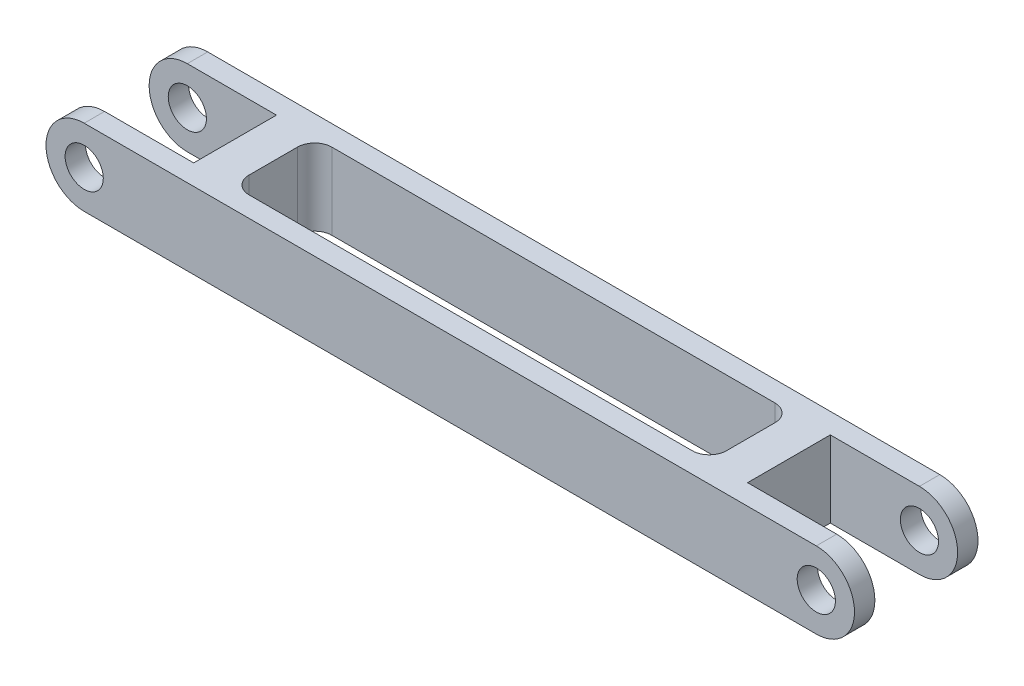
ISO-10303-21;
HEADER;
FILE_DESCRIPTION(('STEP AP214'),'2;1');
FILE_NAME('part.step','',(''),(''),'','','');
FILE_SCHEMA(('AUTOMOTIVE_DESIGN { 1 0 10303 214 1 1 1 1 }'));
ENDSEC;
DATA;
#1=APPLICATION_CONTEXT('core data for automotive mechanical design processes');
#2=APPLICATION_PROTOCOL_DEFINITION('international standard','automotive_design',2000,#1);
#3=PRODUCT_CONTEXT('',#1,'mechanical');
#4=PRODUCT('Part','Part','',(#3));
#5=PRODUCT_RELATED_PRODUCT_CATEGORY('part','',(#4));
#6=PRODUCT_DEFINITION_FORMATION('','',#4);
#7=PRODUCT_DEFINITION_CONTEXT('part definition',#1,'design');
#8=PRODUCT_DEFINITION('design','',#6,#7);
#9=PRODUCT_DEFINITION_SHAPE('','',#8);
#10=(LENGTH_UNIT() NAMED_UNIT(*) SI_UNIT(.MILLI.,.METRE.));
#11=(NAMED_UNIT(*) PLANE_ANGLE_UNIT() SI_UNIT($,.RADIAN.));
#12=(NAMED_UNIT(*) SI_UNIT($,.STERADIAN.) SOLID_ANGLE_UNIT());
#13=UNCERTAINTY_MEASURE_WITH_UNIT(LENGTH_MEASURE(1.E-05),#10,'distance_accuracy_value','');
#14=(GEOMETRIC_REPRESENTATION_CONTEXT(3) GLOBAL_UNCERTAINTY_ASSIGNED_CONTEXT((#13)) GLOBAL_UNIT_ASSIGNED_CONTEXT((#10,
#11,#12)) REPRESENTATION_CONTEXT('',''));
#15=CARTESIAN_POINT('',(0.,0.,0.));
#16=DIRECTION('',(0.,0.,1.));
#17=DIRECTION('',(1.,0.,0.));
#18=AXIS2_PLACEMENT_3D('',#15,#16,#17);
#19=CARTESIAN_POINT('',(-57.5,0.,19.4));
#20=DIRECTION('',(0.,0.,-1.));
#21=DIRECTION('',(-1.,0.,0.));
#22=AXIS2_PLACEMENT_3D('',#19,#20,#21);
#23=CYLINDRICAL_SURFACE('',#22,6.);
#24=CARTESIAN_POINT('',(-57.5,0.,3.2));
#25=DIRECTION('',(0.,0.,-1.));
#26=DIRECTION('',(-1.,0.,0.));
#27=AXIS2_PLACEMENT_3D('',#24,#25,#26);
#28=CIRCLE('',#27,6.);
#29=CARTESIAN_POINT('',(-57.5,-6.00000000000002,3.2));
#30=VERTEX_POINT('',#29);
#31=CARTESIAN_POINT('',(-57.5,6.,3.2));
#32=VERTEX_POINT('',#31);
#33=EDGE_CURVE('E346',#30,#32,#28,.T.);
#34=ORIENTED_EDGE('',*,*,#33,.T.);
#35=DIRECTION('',(0.,0.,-1.));
#36=VECTOR('',#35,1.);
#37=CARTESIAN_POINT('',(-57.5,6.,19.4));
#38=LINE('',#37,#36);
#39=CARTESIAN_POINT('',(-57.5,6.,0.));
#40=VERTEX_POINT('',#39);
#41=EDGE_CURVE('E380',#32,#40,#38,.T.);
#42=ORIENTED_EDGE('',*,*,#41,.T.);
#43=CARTESIAN_POINT('',(-57.5,0.,0.));
#44=DIRECTION('',(0.,0.,1.));
#45=DIRECTION('',(1.,0.,0.));
#46=AXIS2_PLACEMENT_3D('',#43,#44,#45);
#47=CIRCLE('',#46,6.);
#48=CARTESIAN_POINT('',(-57.5,-6.,0.));
#49=VERTEX_POINT('',#48);
#50=EDGE_CURVE('E362',#40,#49,#47,.T.);
#51=ORIENTED_EDGE('',*,*,#50,.T.);
#52=DIRECTION('',(0.,0.,-1.));
#53=VECTOR('',#52,1.);
#54=CARTESIAN_POINT('',(-57.5,-6.,19.4));
#55=LINE('',#54,#53);
#56=EDGE_CURVE('E49',#30,#49,#55,.T.);
#57=ORIENTED_EDGE('',*,*,#56,.F.);
#58=EDGE_LOOP('',(#34,#42,#51,#57));
#59=FACE_BOUND('',#58,.T.);
#60=ADVANCED_FACE('F39',(#59),#23,.T.);
#61=CARTESIAN_POINT('',(57.5,0.,19.4));
#62=DIRECTION('',(0.,0.,-1.));
#63=DIRECTION('',(-1.,0.,0.));
#64=AXIS2_PLACEMENT_3D('',#61,#62,#63);
#65=CYLINDRICAL_SURFACE('',#64,6.);
#66=DIRECTION('',(0.,0.,-1.));
#67=VECTOR('',#66,1.);
#68=CARTESIAN_POINT('',(57.5,6.00000000000002,19.4));
#69=LINE('',#68,#67);
#70=CARTESIAN_POINT('',(57.5,6.00000000000002,3.19999999999999));
#71=VERTEX_POINT('',#70);
#72=CARTESIAN_POINT('',(57.5,6.00000000000002,0.));
#73=VERTEX_POINT('',#72);
#74=EDGE_CURVE('E399',#71,#73,#69,.T.);
#75=ORIENTED_EDGE('',*,*,#74,.F.);
#76=CARTESIAN_POINT('',(57.5,0.,3.19999999999998));
#77=DIRECTION('',(0.,0.,-1.));
#78=DIRECTION('',(-1.,0.,0.));
#79=AXIS2_PLACEMENT_3D('',#76,#77,#78);
#80=CIRCLE('',#79,6.);
#81=CARTESIAN_POINT('',(57.5,-6.,3.19999999999999));
#82=VERTEX_POINT('',#81);
#83=EDGE_CURVE('E339',#71,#82,#80,.T.);
#84=ORIENTED_EDGE('',*,*,#83,.T.);
#85=DIRECTION('',(0.,0.,-1.));
#86=VECTOR('',#85,1.);
#87=CARTESIAN_POINT('',(57.5,-5.99999999999998,19.4));
#88=LINE('',#87,#86);
#89=CARTESIAN_POINT('',(57.5,-5.99999999999998,0.));
#90=VERTEX_POINT('',#89);
#91=EDGE_CURVE('E404',#82,#90,#88,.T.);
#92=ORIENTED_EDGE('',*,*,#91,.T.);
#93=CARTESIAN_POINT('',(57.5,0.,0.));
#94=DIRECTION('',(0.,0.,1.));
#95=DIRECTION('',(1.,0.,0.));
#96=AXIS2_PLACEMENT_3D('',#93,#94,#95);
#97=CIRCLE('',#96,6.);
#98=EDGE_CURVE('E388',#90,#73,#97,.T.);
#99=ORIENTED_EDGE('',*,*,#98,.T.);
#100=EDGE_LOOP('',(#75,#84,#92,#99));
#101=FACE_BOUND('',#100,.T.);
#102=ADVANCED_FACE('F453',(#101),#65,.T.);
#103=CARTESIAN_POINT('',(-57.5,0.,19.4));
#104=DIRECTION('',(0.,0.,-1.));
#105=DIRECTION('',(-1.,0.,0.));
#106=AXIS2_PLACEMENT_3D('',#103,#104,#105);
#107=CYLINDRICAL_SURFACE('',#106,2.99999999999999);
#108=CARTESIAN_POINT('',(-57.5,0.,3.2));
#109=DIRECTION('',(0.,0.,-1.));
#110=DIRECTION('',(-1.,0.,0.));
#111=AXIS2_PLACEMENT_3D('',#108,#109,#110);
#112=CIRCLE('',#111,2.99999999999999);
#113=CARTESIAN_POINT('',(-60.5,0.,3.2));
#114=VERTEX_POINT('',#113);
#115=EDGE_CURVE('E43',#114,#114,#112,.T.);
#116=ORIENTED_EDGE('',*,*,#115,.F.);
#117=EDGE_LOOP('',(#116));
#118=FACE_BOUND('',#117,.T.);
#119=CARTESIAN_POINT('',(-57.5,0.,0.));
#120=DIRECTION('',(0.,0.,1.));
#121=DIRECTION('',(1.,0.,0.));
#122=AXIS2_PLACEMENT_3D('',#119,#120,#121);
#123=CIRCLE('',#122,2.99999999999999);
#124=CARTESIAN_POINT('',(-54.5,0.,0.));
#125=VERTEX_POINT('',#124);
#126=EDGE_CURVE('E354',#125,#125,#123,.T.);
#127=ORIENTED_EDGE('',*,*,#126,.F.);
#128=EDGE_LOOP('',(#127));
#129=FACE_BOUND('',#128,.T.);
#130=ADVANCED_FACE('F425',(#118,#129),#107,.F.);
#131=CARTESIAN_POINT('',(57.5,0.,19.4));
#132=DIRECTION('',(0.,0.,-1.));
#133=DIRECTION('',(-1.,0.,0.));
#134=AXIS2_PLACEMENT_3D('',#131,#132,#133);
#135=CYLINDRICAL_SURFACE('',#134,2.99999999999999);
#136=CARTESIAN_POINT('',(57.5,0.,3.19999999999998));
#137=DIRECTION('',(0.,0.,-1.));
#138=DIRECTION('',(-1.,0.,0.));
#139=AXIS2_PLACEMENT_3D('',#136,#137,#138);
#140=CIRCLE('',#139,2.99999999999999);
#141=CARTESIAN_POINT('',(54.5,0.,3.19999999999999));
#142=VERTEX_POINT('',#141);
#143=EDGE_CURVE('E338',#142,#142,#140,.T.);
#144=ORIENTED_EDGE('',*,*,#143,.F.);
#145=EDGE_LOOP('',(#144));
#146=FACE_BOUND('',#145,.T.);
#147=CARTESIAN_POINT('',(57.5,0.,0.));
#148=DIRECTION('',(0.,0.,1.));
#149=DIRECTION('',(1.,0.,0.));
#150=AXIS2_PLACEMENT_3D('',#147,#148,#149);
#151=CIRCLE('',#150,2.99999999999999);
#152=CARTESIAN_POINT('',(60.5,0.,0.));
#153=VERTEX_POINT('',#152);
#154=EDGE_CURVE('E349',#153,#153,#151,.T.);
#155=ORIENTED_EDGE('',*,*,#154,.F.);
#156=EDGE_LOOP('',(#155));
#157=FACE_BOUND('',#156,.T.);
#158=ADVANCED_FACE('F432',(#146,#157),#135,.F.);
#159=CARTESIAN_POINT('',(-57.5,0.,19.4));
#160=DIRECTION('',(0.,0.,1.));
#161=DIRECTION('',(1.,0.,0.));
#162=AXIS2_PLACEMENT_3D('',#159,#160,#161);
#163=PLANE('',#162);
#164=CARTESIAN_POINT('',(-57.5,0.,19.4));
#165=DIRECTION('',(0.,0.,1.));
#166=DIRECTION('',(1.,0.,0.));
#167=AXIS2_PLACEMENT_3D('',#164,#165,#166);
#168=CIRCLE('',#167,2.99999999999999);
#169=CARTESIAN_POINT('',(-54.5,0.,19.4));
#170=VERTEX_POINT('',#169);
#171=EDGE_CURVE('E358',#170,#170,#168,.T.);
#172=ORIENTED_EDGE('',*,*,#171,.F.);
#173=EDGE_LOOP('',(#172));
#174=FACE_BOUND('',#173,.T.);
#175=CARTESIAN_POINT('',(-57.5,0.,19.4));
#176=DIRECTION('',(0.,0.,1.));
#177=DIRECTION('',(1.,0.,0.));
#178=AXIS2_PLACEMENT_3D('',#175,#176,#177);
#179=CIRCLE('',#178,6.);
#180=CARTESIAN_POINT('',(-57.5,6.,19.4));
#181=VERTEX_POINT('',#180);
#182=CARTESIAN_POINT('',(-57.5,-6.,19.4));
#183=VERTEX_POINT('',#182);
#184=EDGE_CURVE('E366',#181,#183,#179,.T.);
#185=ORIENTED_EDGE('',*,*,#184,.T.);
#186=DIRECTION('',(1.,0.,0.));
#187=VECTOR('',#186,1.);
#188=CARTESIAN_POINT('',(-57.5,-6.,19.4));
#189=LINE('',#188,#187);
#190=CARTESIAN_POINT('',(57.5,-5.99999999999998,19.4));
#191=VERTEX_POINT('',#190);
#192=EDGE_CURVE('E370',#183,#191,#189,.T.);
#193=ORIENTED_EDGE('',*,*,#192,.T.);
#194=CARTESIAN_POINT('',(57.5,0.,19.4));
#195=DIRECTION('',(0.,0.,1.));
#196=DIRECTION('',(1.,0.,0.));
#197=AXIS2_PLACEMENT_3D('',#194,#195,#196);
#198=CIRCLE('',#197,6.);
#199=CARTESIAN_POINT('',(57.5,6.00000000000002,19.4));
#200=VERTEX_POINT('',#199);
#201=EDGE_CURVE('E374',#191,#200,#198,.T.);
#202=ORIENTED_EDGE('',*,*,#201,.T.);
#203=DIRECTION('',(-1.,0.,0.));
#204=VECTOR('',#203,1.);
#205=CARTESIAN_POINT('',(-57.5,6.,19.4));
#206=LINE('',#205,#204);
#207=EDGE_CURVE('E377',#200,#181,#206,.T.);
#208=ORIENTED_EDGE('',*,*,#207,.T.);
#209=EDGE_LOOP('',(#185,#193,#202,#208));
#210=FACE_BOUND('',#209,.T.);
#211=CARTESIAN_POINT('',(57.5,0.,19.4));
#212=DIRECTION('',(0.,0.,1.));
#213=DIRECTION('',(1.,0.,0.));
#214=AXIS2_PLACEMENT_3D('',#211,#212,#213);
#215=CIRCLE('',#214,2.99999999999999);
#216=CARTESIAN_POINT('',(60.5,0.,19.4));
#217=VERTEX_POINT('',#216);
#218=EDGE_CURVE('E350',#217,#217,#215,.T.);
#219=ORIENTED_EDGE('',*,*,#218,.F.);
#220=EDGE_LOOP('',(#219));
#221=FACE_BOUND('',#220,.T.);
#222=ADVANCED_FACE('F428',(#174,#210,#221),#163,.T.);
#223=CARTESIAN_POINT('',(-57.5,0.,0.));
#224=DIRECTION('',(0.,0.,1.));
#225=DIRECTION('',(1.,0.,0.));
#226=AXIS2_PLACEMENT_3D('',#223,#224,#225);
#227=PLANE('',#226);
#228=ORIENTED_EDGE('',*,*,#50,.F.);
#229=DIRECTION('',(-1.,0.,0.));
#230=VECTOR('',#229,1.);
#231=CARTESIAN_POINT('',(-57.5,6.,0.));
#232=LINE('',#231,#230);
#233=EDGE_CURVE('E371',#73,#40,#232,.T.);
#234=ORIENTED_EDGE('',*,*,#233,.F.);
#235=ORIENTED_EDGE('',*,*,#98,.F.);
#236=DIRECTION('',(1.,0.,0.));
#237=VECTOR('',#236,1.);
#238=CARTESIAN_POINT('',(-57.5,-6.,0.));
#239=LINE('',#238,#237);
#240=EDGE_CURVE('E384',#49,#90,#239,.T.);
#241=ORIENTED_EDGE('',*,*,#240,.F.);
#242=EDGE_LOOP('',(#228,#234,#235,#241));
#243=FACE_BOUND('',#242,.T.);
#244=ORIENTED_EDGE('',*,*,#126,.T.);
#245=EDGE_LOOP('',(#244));
#246=FACE_BOUND('',#245,.T.);
#247=ORIENTED_EDGE('',*,*,#154,.T.);
#248=EDGE_LOOP('',(#247));
#249=FACE_BOUND('',#248,.T.);
#250=ADVANCED_FACE('F431',(#243,#246,#249),#227,.F.);
#251=CARTESIAN_POINT('',(-57.5,6.,16.2));
#252=VERTEX_POINT('',#251);
#253=EDGE_CURVE('E395',#181,#252,#38,.T.);
#254=ORIENTED_EDGE('',*,*,#253,.T.);
#255=CARTESIAN_POINT('',(-57.5,0.,16.2));
#256=DIRECTION('',(0.,0.,1.));
#257=DIRECTION('',(1.,0.,0.));
#258=AXIS2_PLACEMENT_3D('',#255,#256,#257);
#259=CIRCLE('',#258,6.);
#260=CARTESIAN_POINT('',(-57.5,-6.00000000000002,16.2));
#261=VERTEX_POINT('',#260);
#262=EDGE_CURVE('E343',#252,#261,#259,.T.);
#263=ORIENTED_EDGE('',*,*,#262,.T.);
#264=EDGE_CURVE('E11',#183,#261,#55,.T.);
#265=ORIENTED_EDGE('',*,*,#264,.F.);
#266=ORIENTED_EDGE('',*,*,#184,.F.);
#267=EDGE_LOOP('',(#254,#263,#265,#266));
#268=FACE_BOUND('',#267,.T.);
#269=ADVANCED_FACE('F41',(#268),#23,.T.);
#270=CARTESIAN_POINT('',(-57.5,-6.,19.4));
#271=DIRECTION('',(0.,1.,0.));
#272=DIRECTION('',(-1.,0.,0.));
#273=AXIS2_PLACEMENT_3D('',#270,#271,#272);
#274=PLANE('',#273);
#275=DIRECTION('',(0.,0.,-1.));
#276=VECTOR('',#275,1.);
#277=CARTESIAN_POINT('',(-43.5,-6.00000000000002,3.2));
#278=LINE('',#277,#276);
#279=CARTESIAN_POINT('',(-43.5,-6.00000000000002,16.2));
#280=VERTEX_POINT('',#279);
#281=CARTESIAN_POINT('',(-43.5,-6.00000000000002,3.2));
#282=VERTEX_POINT('',#281);
#283=EDGE_CURVE('E195',#280,#282,#278,.T.);
#284=ORIENTED_EDGE('',*,*,#283,.T.);
#285=DIRECTION('',(-1.,0.,0.));
#286=VECTOR('',#285,1.);
#287=CARTESIAN_POINT('',(-63.5,-6.00000000000002,3.2));
#288=LINE('',#287,#286);
#289=EDGE_CURVE('E192',#282,#30,#288,.T.);
#290=ORIENTED_EDGE('',*,*,#289,.T.);
#291=ORIENTED_EDGE('',*,*,#56,.T.);
#292=ORIENTED_EDGE('',*,*,#240,.T.);
#293=ORIENTED_EDGE('',*,*,#91,.F.);
#294=DIRECTION('',(-1.,0.,0.));
#295=VECTOR('',#294,1.);
#296=CARTESIAN_POINT('',(63.5,-6.,3.19999999999998));
#297=LINE('',#296,#295);
#298=CARTESIAN_POINT('',(43.5,-6.,3.19999999999999));
#299=VERTEX_POINT('',#298);
#300=EDGE_CURVE('E223',#82,#299,#297,.T.);
#301=ORIENTED_EDGE('',*,*,#300,.T.);
#302=DIRECTION('',(0.,0.,1.));
#303=VECTOR('',#302,1.);
#304=CARTESIAN_POINT('',(43.5,-6.,3.19999999999999));
#305=LINE('',#304,#303);
#306=CARTESIAN_POINT('',(43.5,-6.,16.2));
#307=VERTEX_POINT('',#306);
#308=EDGE_CURVE('E227',#299,#307,#305,.T.);
#309=ORIENTED_EDGE('',*,*,#308,.T.);
#310=DIRECTION('',(1.,0.,0.));
#311=VECTOR('',#310,1.);
#312=CARTESIAN_POINT('',(63.5,-6.,16.2));
#313=LINE('',#312,#311);
#314=CARTESIAN_POINT('',(57.5,-6.,16.2));
#315=VERTEX_POINT('',#314);
#316=EDGE_CURVE('E232',#307,#315,#313,.T.);
#317=ORIENTED_EDGE('',*,*,#316,.T.);
#318=EDGE_CURVE('E405',#191,#315,#88,.T.);
#319=ORIENTED_EDGE('',*,*,#318,.F.);
#320=ORIENTED_EDGE('',*,*,#192,.F.);
#321=ORIENTED_EDGE('',*,*,#264,.T.);
#322=DIRECTION('',(1.,0.,0.));
#323=VECTOR('',#322,1.);
#324=CARTESIAN_POINT('',(-63.5,-6.00000000000002,16.2));
#325=LINE('',#324,#323);
#326=EDGE_CURVE('E184',#261,#280,#325,.T.);
#327=ORIENTED_EDGE('',*,*,#326,.T.);
#328=EDGE_LOOP('',(#284,#290,#291,#292,#293,#301,#309,#317,#319,#320,#321,#327));
#329=FACE_BOUND('',#328,.T.);
#330=DIRECTION('',(1.,0.,0.));
#331=VECTOR('',#330,1.);
#332=CARTESIAN_POINT('',(-34.8,-6.00000000000002,16.2));
#333=LINE('',#332,#331);
#334=CARTESIAN_POINT('',(-34.8,-6.00000000000002,16.2));
#335=VERTEX_POINT('',#334);
#336=CARTESIAN_POINT('',(34.8,-6.00000000000001,16.2));
#337=VERTEX_POINT('',#336);
#338=EDGE_CURVE('E277',#335,#337,#333,.T.);
#339=ORIENTED_EDGE('',*,*,#338,.T.);
#340=CARTESIAN_POINT('',(34.8,-6.00000000000001,13.5));
#341=DIRECTION('',(0.,1.,0.));
#342=DIRECTION('',(1.,0.,0.));
#343=AXIS2_PLACEMENT_3D('',#340,#341,#342);
#344=CIRCLE('',#343,2.7);
#345=CARTESIAN_POINT('',(37.5,-6.00000000000001,13.5));
#346=VERTEX_POINT('',#345);
#347=EDGE_CURVE('E250',#337,#346,#344,.T.);
#348=ORIENTED_EDGE('',*,*,#347,.T.);
#349=DIRECTION('',(0.,0.,-1.));
#350=VECTOR('',#349,1.);
#351=CARTESIAN_POINT('',(37.5,-6.00000000000001,5.9));
#352=LINE('',#351,#350);
#353=CARTESIAN_POINT('',(37.5,-5.99999999999998,5.9));
#354=VERTEX_POINT('',#353);
#355=EDGE_CURVE('E254',#346,#354,#352,.T.);
#356=ORIENTED_EDGE('',*,*,#355,.T.);
#357=CARTESIAN_POINT('',(34.8,-6.00000000000001,5.9));
#358=DIRECTION('',(0.,1.,0.));
#359=DIRECTION('',(-1.,0.,0.));
#360=AXIS2_PLACEMENT_3D('',#357,#358,#359);
#361=CIRCLE('',#360,2.7);
#362=CARTESIAN_POINT('',(34.8,-6.00000000000001,3.2));
#363=VERTEX_POINT('',#362);
#364=EDGE_CURVE('E57',#354,#363,#361,.T.);
#365=ORIENTED_EDGE('',*,*,#364,.T.);
#366=DIRECTION('',(-1.,0.,0.));
#367=VECTOR('',#366,1.);
#368=CARTESIAN_POINT('',(-34.8,-6.00000000000002,3.2));
#369=LINE('',#368,#367);
#370=CARTESIAN_POINT('',(-34.8,-6.00000000000002,3.2));
#371=VERTEX_POINT('',#370);
#372=EDGE_CURVE('E261',#363,#371,#369,.T.);
#373=ORIENTED_EDGE('',*,*,#372,.T.);
#374=CARTESIAN_POINT('',(-34.8,-6.00000000000002,5.9));
#375=DIRECTION('',(0.,1.,0.));
#376=DIRECTION('',(-1.,0.,0.));
#377=AXIS2_PLACEMENT_3D('',#374,#375,#376);
#378=CIRCLE('',#377,2.7);
#379=CARTESIAN_POINT('',(-37.5,-6.00000000000002,5.9));
#380=VERTEX_POINT('',#379);
#381=EDGE_CURVE('E265',#371,#380,#378,.T.);
#382=ORIENTED_EDGE('',*,*,#381,.T.);
#383=DIRECTION('',(0.,0.,1.));
#384=VECTOR('',#383,1.);
#385=CARTESIAN_POINT('',(-37.5,-6.00000000000002,5.9));
#386=LINE('',#385,#384);
#387=CARTESIAN_POINT('',(-37.5,-6.00000000000002,13.5));
#388=VERTEX_POINT('',#387);
#389=EDGE_CURVE('E269',#380,#388,#386,.T.);
#390=ORIENTED_EDGE('',*,*,#389,.T.);
#391=CARTESIAN_POINT('',(-34.8,-6.00000000000002,13.5));
#392=DIRECTION('',(0.,1.,0.));
#393=DIRECTION('',(1.,0.,0.));
#394=AXIS2_PLACEMENT_3D('',#391,#392,#393);
#395=CIRCLE('',#394,2.7);
#396=EDGE_CURVE('E273',#388,#335,#395,.T.);
#397=ORIENTED_EDGE('',*,*,#396,.T.);
#398=EDGE_LOOP('',(#339,#348,#356,#365,#373,#382,#390,#397));
#399=FACE_BOUND('',#398,.T.);
#400=ADVANCED_FACE('F202',(#329,#399),#274,.F.);
#401=CARTESIAN_POINT('',(57.5,0.,16.2));
#402=DIRECTION('',(0.,0.,1.));
#403=DIRECTION('',(1.,0.,0.));
#404=AXIS2_PLACEMENT_3D('',#401,#402,#403);
#405=CIRCLE('',#404,6.);
#406=CARTESIAN_POINT('',(57.5,6.00000000000002,16.2));
#407=VERTEX_POINT('',#406);
#408=EDGE_CURVE('E335',#315,#407,#405,.T.);
#409=ORIENTED_EDGE('',*,*,#408,.T.);
#410=EDGE_CURVE('E400',#200,#407,#69,.T.);
#411=ORIENTED_EDGE('',*,*,#410,.F.);
#412=ORIENTED_EDGE('',*,*,#201,.F.);
#413=ORIENTED_EDGE('',*,*,#318,.T.);
#414=EDGE_LOOP('',(#409,#411,#412,#413));
#415=FACE_BOUND('',#414,.T.);
#416=ADVANCED_FACE('F460',(#415),#65,.T.);
#417=CARTESIAN_POINT('',(-57.5,6.,19.4));
#418=DIRECTION('',(0.,-1.,0.));
#419=DIRECTION('',(1.,0.,0.));
#420=AXIS2_PLACEMENT_3D('',#417,#418,#419);
#421=PLANE('',#420);
#422=DIRECTION('',(0.,0.,-1.));
#423=VECTOR('',#422,1.);
#424=CARTESIAN_POINT('',(37.5,6.00000000000002,5.9));
#425=LINE('',#424,#423);
#426=CARTESIAN_POINT('',(37.5,6.00000000000002,13.5));
#427=VERTEX_POINT('',#426);
#428=CARTESIAN_POINT('',(37.5,6.00000000000002,5.9));
#429=VERTEX_POINT('',#428);
#430=EDGE_CURVE('E285',#427,#429,#425,.T.);
#431=ORIENTED_EDGE('',*,*,#430,.F.);
#432=CARTESIAN_POINT('',(34.8,6.00000000000002,13.5));
#433=DIRECTION('',(0.,1.,0.));
#434=DIRECTION('',(1.,0.,0.));
#435=AXIS2_PLACEMENT_3D('',#432,#433,#434);
#436=CIRCLE('',#435,2.7);
#437=CARTESIAN_POINT('',(34.8,6.00000000000002,16.2));
#438=VERTEX_POINT('',#437);
#439=EDGE_CURVE('E282',#438,#427,#436,.T.);
#440=ORIENTED_EDGE('',*,*,#439,.F.);
#441=DIRECTION('',(1.,0.,0.));
#442=VECTOR('',#441,1.);
#443=CARTESIAN_POINT('',(-34.8,6.,16.2));
#444=LINE('',#443,#442);
#445=CARTESIAN_POINT('',(-34.8,6.,16.2));
#446=VERTEX_POINT('',#445);
#447=EDGE_CURVE('E255',#446,#438,#444,.T.);
#448=ORIENTED_EDGE('',*,*,#447,.F.);
#449=CARTESIAN_POINT('',(-34.8,6.,13.5));
#450=DIRECTION('',(0.,1.,0.));
#451=DIRECTION('',(1.,0.,0.));
#452=AXIS2_PLACEMENT_3D('',#449,#450,#451);
#453=CIRCLE('',#452,2.7);
#454=CARTESIAN_POINT('',(-37.5,6.,13.5));
#455=VERTEX_POINT('',#454);
#456=EDGE_CURVE('E305',#455,#446,#453,.T.);
#457=ORIENTED_EDGE('',*,*,#456,.F.);
#458=DIRECTION('',(0.,0.,1.));
#459=VECTOR('',#458,1.);
#460=CARTESIAN_POINT('',(-37.5,6.,5.9));
#461=LINE('',#460,#459);
#462=CARTESIAN_POINT('',(-37.5,6.,5.9));
#463=VERTEX_POINT('',#462);
#464=EDGE_CURVE('E301',#463,#455,#461,.T.);
#465=ORIENTED_EDGE('',*,*,#464,.F.);
#466=CARTESIAN_POINT('',(-34.8,6.,5.9));
#467=DIRECTION('',(0.,1.,0.));
#468=DIRECTION('',(-1.,0.,0.));
#469=AXIS2_PLACEMENT_3D('',#466,#467,#468);
#470=CIRCLE('',#469,2.7);
#471=CARTESIAN_POINT('',(-34.8,6.,3.2));
#472=VERTEX_POINT('',#471);
#473=EDGE_CURVE('E297',#472,#463,#470,.T.);
#474=ORIENTED_EDGE('',*,*,#473,.F.);
#475=DIRECTION('',(-1.,0.,0.));
#476=VECTOR('',#475,1.);
#477=CARTESIAN_POINT('',(-34.8,6.,3.2));
#478=LINE('',#477,#476);
#479=CARTESIAN_POINT('',(34.8,6.00000000000002,3.2));
#480=VERTEX_POINT('',#479);
#481=EDGE_CURVE('E293',#480,#472,#478,.T.);
#482=ORIENTED_EDGE('',*,*,#481,.F.);
#483=CARTESIAN_POINT('',(34.8,6.00000000000002,5.9));
#484=DIRECTION('',(0.,1.,0.));
#485=DIRECTION('',(-1.,0.,0.));
#486=AXIS2_PLACEMENT_3D('',#483,#484,#485);
#487=CIRCLE('',#486,2.7);
#488=EDGE_CURVE('E289',#429,#480,#487,.T.);
#489=ORIENTED_EDGE('',*,*,#488,.F.);
#490=EDGE_LOOP('',(#431,#440,#448,#457,#465,#474,#482,#489));
#491=FACE_BOUND('',#490,.T.);
#492=ORIENTED_EDGE('',*,*,#41,.F.);
#493=DIRECTION('',(-1.,0.,0.));
#494=VECTOR('',#493,1.);
#495=CARTESIAN_POINT('',(-63.5,6.,3.2));
#496=LINE('',#495,#494);
#497=CARTESIAN_POINT('',(-43.5,6.,3.2));
#498=VERTEX_POINT('',#497);
#499=EDGE_CURVE('E206',#498,#32,#496,.T.);
#500=ORIENTED_EDGE('',*,*,#499,.F.);
#501=DIRECTION('',(0.,0.,-1.));
#502=VECTOR('',#501,1.);
#503=CARTESIAN_POINT('',(-43.5,6.,3.2));
#504=LINE('',#503,#502);
#505=CARTESIAN_POINT('',(-43.5,6.,16.2));
#506=VERTEX_POINT('',#505);
#507=EDGE_CURVE('E210',#506,#498,#504,.T.);
#508=ORIENTED_EDGE('',*,*,#507,.F.);
#509=DIRECTION('',(1.,0.,0.));
#510=VECTOR('',#509,1.);
#511=CARTESIAN_POINT('',(-63.5,6.,16.2));
#512=LINE('',#511,#510);
#513=EDGE_CURVE('E186',#252,#506,#512,.T.);
#514=ORIENTED_EDGE('',*,*,#513,.F.);
#515=ORIENTED_EDGE('',*,*,#253,.F.);
#516=ORIENTED_EDGE('',*,*,#207,.F.);
#517=ORIENTED_EDGE('',*,*,#410,.T.);
#518=DIRECTION('',(1.,0.,0.));
#519=VECTOR('',#518,1.);
#520=CARTESIAN_POINT('',(63.5,6.00000000000002,16.2));
#521=LINE('',#520,#519);
#522=CARTESIAN_POINT('',(43.5,6.00000000000002,16.2));
#523=VERTEX_POINT('',#522);
#524=EDGE_CURVE('E228',#523,#407,#521,.T.);
#525=ORIENTED_EDGE('',*,*,#524,.F.);
#526=DIRECTION('',(0.,0.,1.));
#527=VECTOR('',#526,1.);
#528=CARTESIAN_POINT('',(43.5,6.00000000000002,3.19999999999999));
#529=LINE('',#528,#527);
#530=CARTESIAN_POINT('',(43.5,6.00000000000002,3.19999999999999));
#531=VERTEX_POINT('',#530);
#532=EDGE_CURVE('E239',#531,#523,#529,.T.);
#533=ORIENTED_EDGE('',*,*,#532,.F.);
#534=DIRECTION('',(-1.,0.,0.));
#535=VECTOR('',#534,1.);
#536=CARTESIAN_POINT('',(63.5,6.00000000000002,3.19999999999998));
#537=LINE('',#536,#535);
#538=EDGE_CURVE('E236',#71,#531,#537,.T.);
#539=ORIENTED_EDGE('',*,*,#538,.F.);
#540=ORIENTED_EDGE('',*,*,#74,.T.);
#541=ORIENTED_EDGE('',*,*,#233,.T.);
#542=EDGE_LOOP('',(#492,#500,#508,#514,#515,#516,#517,#525,#533,#539,#540,#541));
#543=FACE_BOUND('',#542,.T.);
#544=ADVANCED_FACE('F423',(#491,#543),#421,.F.);
#545=CARTESIAN_POINT('',(-57.5,0.,16.2));
#546=DIRECTION('',(0.,0.,1.));
#547=DIRECTION('',(1.,0.,0.));
#548=AXIS2_PLACEMENT_3D('',#545,#546,#547);
#549=CIRCLE('',#548,2.99999999999999);
#550=CARTESIAN_POINT('',(-54.5,0.,16.2));
#551=VERTEX_POINT('',#550);
#552=EDGE_CURVE('E342',#551,#551,#549,.T.);
#553=ORIENTED_EDGE('',*,*,#552,.F.);
#554=EDGE_LOOP('',(#553));
#555=FACE_BOUND('',#554,.T.);
#556=ORIENTED_EDGE('',*,*,#171,.T.);
#557=EDGE_LOOP('',(#556));
#558=FACE_BOUND('',#557,.T.);
#559=ADVANCED_FACE('F419',(#555,#558),#107,.F.);
#560=CARTESIAN_POINT('',(57.5,0.,16.2));
#561=DIRECTION('',(0.,0.,1.));
#562=DIRECTION('',(1.,0.,0.));
#563=AXIS2_PLACEMENT_3D('',#560,#561,#562);
#564=CIRCLE('',#563,2.99999999999999);
#565=CARTESIAN_POINT('',(60.5,0.,16.2));
#566=VERTEX_POINT('',#565);
#567=EDGE_CURVE('E221',#566,#566,#564,.T.);
#568=ORIENTED_EDGE('',*,*,#567,.F.);
#569=EDGE_LOOP('',(#568));
#570=FACE_BOUND('',#569,.T.);
#571=ORIENTED_EDGE('',*,*,#218,.T.);
#572=EDGE_LOOP('',(#571));
#573=FACE_BOUND('',#572,.T.);
#574=ADVANCED_FACE('F422',(#570,#573),#135,.F.);
#575=CARTESIAN_POINT('',(63.5,-6.,3.19999999999998));
#576=DIRECTION('',(0.,0.,-1.));
#577=DIRECTION('',(-1.,0.,0.));
#578=AXIS2_PLACEMENT_3D('',#575,#576,#577);
#579=PLANE('',#578);
#580=ORIENTED_EDGE('',*,*,#143,.T.);
#581=EDGE_LOOP('',(#580));
#582=FACE_BOUND('',#581,.T.);
#583=ORIENTED_EDGE('',*,*,#538,.T.);
#584=DIRECTION('',(0.,1.,0.));
#585=VECTOR('',#584,1.);
#586=CARTESIAN_POINT('',(43.5,-6.,3.19999999999999));
#587=LINE('',#586,#585);
#588=EDGE_CURVE('E65',#299,#531,#587,.T.);
#589=ORIENTED_EDGE('',*,*,#588,.F.);
#590=ORIENTED_EDGE('',*,*,#300,.F.);
#591=ORIENTED_EDGE('',*,*,#83,.F.);
#592=EDGE_LOOP('',(#583,#589,#590,#591));
#593=FACE_BOUND('',#592,.T.);
#594=ADVANCED_FACE('F439',(#582,#593),#579,.F.);
#595=CARTESIAN_POINT('',(63.5,-6.,16.2));
#596=DIRECTION('',(0.,0.,1.));
#597=DIRECTION('',(1.,0.,0.));
#598=AXIS2_PLACEMENT_3D('',#595,#596,#597);
#599=PLANE('',#598);
#600=ORIENTED_EDGE('',*,*,#567,.T.);
#601=EDGE_LOOP('',(#600));
#602=FACE_BOUND('',#601,.T.);
#603=ORIENTED_EDGE('',*,*,#408,.F.);
#604=ORIENTED_EDGE('',*,*,#316,.F.);
#605=DIRECTION('',(0.,1.,0.));
#606=VECTOR('',#605,1.);
#607=CARTESIAN_POINT('',(43.5,-6.,16.2));
#608=LINE('',#607,#606);
#609=EDGE_CURVE('E217',#307,#523,#608,.T.);
#610=ORIENTED_EDGE('',*,*,#609,.T.);
#611=ORIENTED_EDGE('',*,*,#524,.T.);
#612=EDGE_LOOP('',(#603,#604,#610,#611));
#613=FACE_BOUND('',#612,.T.);
#614=ADVANCED_FACE('F445',(#602,#613),#599,.F.);
#615=CARTESIAN_POINT('',(43.5,-6.,3.19999999999999));
#616=DIRECTION('',(-1.,0.,0.));
#617=DIRECTION('',(0.,-1.,0.));
#618=AXIS2_PLACEMENT_3D('',#615,#616,#617);
#619=PLANE('',#618);
#620=ORIENTED_EDGE('',*,*,#532,.T.);
#621=ORIENTED_EDGE('',*,*,#609,.F.);
#622=ORIENTED_EDGE('',*,*,#308,.F.);
#623=ORIENTED_EDGE('',*,*,#588,.T.);
#624=EDGE_LOOP('',(#620,#621,#622,#623));
#625=FACE_BOUND('',#624,.T.);
#626=ADVANCED_FACE('F513',(#625),#619,.F.);
#627=CARTESIAN_POINT('',(-63.5,-6.00000000000002,3.2));
#628=DIRECTION('',(0.,0.,-1.));
#629=DIRECTION('',(-1.,0.,0.));
#630=AXIS2_PLACEMENT_3D('',#627,#628,#629);
#631=PLANE('',#630);
#632=ORIENTED_EDGE('',*,*,#115,.T.);
#633=EDGE_LOOP('',(#632));
#634=FACE_BOUND('',#633,.T.);
#635=ORIENTED_EDGE('',*,*,#33,.F.);
#636=ORIENTED_EDGE('',*,*,#289,.F.);
#637=DIRECTION('',(0.,1.,0.));
#638=VECTOR('',#637,1.);
#639=CARTESIAN_POINT('',(-43.5,-6.00000000000002,3.2));
#640=LINE('',#639,#638);
#641=EDGE_CURVE('E191',#282,#498,#640,.T.);
#642=ORIENTED_EDGE('',*,*,#641,.T.);
#643=ORIENTED_EDGE('',*,*,#499,.T.);
#644=EDGE_LOOP('',(#635,#636,#642,#643));
#645=FACE_BOUND('',#644,.T.);
#646=ADVANCED_FACE('F475',(#634,#645),#631,.F.);
#647=CARTESIAN_POINT('',(-63.5,-6.00000000000002,16.2));
#648=DIRECTION('',(0.,0.,1.));
#649=DIRECTION('',(1.,0.,0.));
#650=AXIS2_PLACEMENT_3D('',#647,#648,#649);
#651=PLANE('',#650);
#652=ORIENTED_EDGE('',*,*,#552,.T.);
#653=EDGE_LOOP('',(#652));
#654=FACE_BOUND('',#653,.T.);
#655=ORIENTED_EDGE('',*,*,#513,.T.);
#656=DIRECTION('',(0.,1.,0.));
#657=VECTOR('',#656,1.);
#658=CARTESIAN_POINT('',(-43.5,-6.00000000000002,16.2));
#659=LINE('',#658,#657);
#660=EDGE_CURVE('E180',#280,#506,#659,.T.);
#661=ORIENTED_EDGE('',*,*,#660,.F.);
#662=ORIENTED_EDGE('',*,*,#326,.F.);
#663=ORIENTED_EDGE('',*,*,#262,.F.);
#664=EDGE_LOOP('',(#655,#661,#662,#663));
#665=FACE_BOUND('',#664,.T.);
#666=ADVANCED_FACE('F182',(#654,#665),#651,.F.);
#667=CARTESIAN_POINT('',(-43.5,-6.00000000000002,3.2));
#668=DIRECTION('',(1.,0.,0.));
#669=DIRECTION('',(0.,1.,0.));
#670=AXIS2_PLACEMENT_3D('',#667,#668,#669);
#671=PLANE('',#670);
#672=ORIENTED_EDGE('',*,*,#507,.T.);
#673=ORIENTED_EDGE('',*,*,#641,.F.);
#674=ORIENTED_EDGE('',*,*,#283,.F.);
#675=ORIENTED_EDGE('',*,*,#660,.T.);
#676=EDGE_LOOP('',(#672,#673,#674,#675));
#677=FACE_BOUND('',#676,.T.);
#678=ADVANCED_FACE('F196',(#677),#671,.F.);
#679=CARTESIAN_POINT('',(34.8,-6.00000000000001,13.5));
#680=DIRECTION('',(0.,1.,0.));
#681=DIRECTION('',(-1.,0.,0.));
#682=AXIS2_PLACEMENT_3D('',#679,#680,#681);
#683=CYLINDRICAL_SURFACE('',#682,2.7);
#684=ORIENTED_EDGE('',*,*,#439,.T.);
#685=DIRECTION('',(0.,1.,0.));
#686=VECTOR('',#685,1.);
#687=CARTESIAN_POINT('',(37.5,-6.00000000000001,13.5));
#688=LINE('',#687,#686);
#689=EDGE_CURVE('E281',#346,#427,#688,.T.);
#690=ORIENTED_EDGE('',*,*,#689,.F.);
#691=ORIENTED_EDGE('',*,*,#347,.F.);
#692=DIRECTION('',(0.,1.,0.));
#693=VECTOR('',#692,1.);
#694=CARTESIAN_POINT('',(34.8,-6.00000000000001,16.2));
#695=LINE('',#694,#693);
#696=EDGE_CURVE('E240',#337,#438,#695,.T.);
#697=ORIENTED_EDGE('',*,*,#696,.T.);
#698=EDGE_LOOP('',(#684,#690,#691,#697));
#699=FACE_BOUND('',#698,.T.);
#700=ADVANCED_FACE('F534',(#699),#683,.F.);
#701=CARTESIAN_POINT('',(-34.8,-6.00000000000002,16.2));
#702=DIRECTION('',(0.,0.,1.));
#703=DIRECTION('',(1.,0.,0.));
#704=AXIS2_PLACEMENT_3D('',#701,#702,#703);
#705=PLANE('',#704);
#706=ORIENTED_EDGE('',*,*,#447,.T.);
#707=ORIENTED_EDGE('',*,*,#696,.F.);
#708=ORIENTED_EDGE('',*,*,#338,.F.);
#709=DIRECTION('',(0.,1.,0.));
#710=VECTOR('',#709,1.);
#711=CARTESIAN_POINT('',(-34.8,-6.00000000000002,16.2));
#712=LINE('',#711,#710);
#713=EDGE_CURVE('E314',#335,#446,#712,.T.);
#714=ORIENTED_EDGE('',*,*,#713,.T.);
#715=EDGE_LOOP('',(#706,#707,#708,#714));
#716=FACE_BOUND('',#715,.T.);
#717=ADVANCED_FACE('F530',(#716),#705,.F.);
#718=CARTESIAN_POINT('',(-34.8,-6.00000000000002,13.5));
#719=DIRECTION('',(0.,1.,0.));
#720=DIRECTION('',(-1.,0.,0.));
#721=AXIS2_PLACEMENT_3D('',#718,#719,#720);
#722=CYLINDRICAL_SURFACE('',#721,2.7);
#723=ORIENTED_EDGE('',*,*,#456,.T.);
#724=ORIENTED_EDGE('',*,*,#713,.F.);
#725=ORIENTED_EDGE('',*,*,#396,.F.);
#726=DIRECTION('',(0.,1.,0.));
#727=VECTOR('',#726,1.);
#728=CARTESIAN_POINT('',(-37.5,-6.00000000000002,13.5));
#729=LINE('',#728,#727);
#730=EDGE_CURVE('E317',#388,#455,#729,.T.);
#731=ORIENTED_EDGE('',*,*,#730,.T.);
#732=EDGE_LOOP('',(#723,#724,#725,#731));
#733=FACE_BOUND('',#732,.T.);
#734=ADVANCED_FACE('F533',(#733),#722,.F.);
#735=CARTESIAN_POINT('',(-37.5,-6.00000000000002,5.9));
#736=DIRECTION('',(-1.,0.,0.));
#737=DIRECTION('',(0.,-1.,0.));
#738=AXIS2_PLACEMENT_3D('',#735,#736,#737);
#739=PLANE('',#738);
#740=ORIENTED_EDGE('',*,*,#464,.T.);
#741=ORIENTED_EDGE('',*,*,#730,.F.);
#742=ORIENTED_EDGE('',*,*,#389,.F.);
#743=DIRECTION('',(0.,1.,0.));
#744=VECTOR('',#743,1.);
#745=CARTESIAN_POINT('',(-37.5,-6.00000000000002,5.9));
#746=LINE('',#745,#744);
#747=EDGE_CURVE('E320',#380,#463,#746,.T.);
#748=ORIENTED_EDGE('',*,*,#747,.T.);
#749=EDGE_LOOP('',(#740,#741,#742,#748));
#750=FACE_BOUND('',#749,.T.);
#751=ADVANCED_FACE('F538',(#750),#739,.F.);
#752=CARTESIAN_POINT('',(-34.8,-6.00000000000002,5.9));
#753=DIRECTION('',(0.,1.,0.));
#754=DIRECTION('',(-1.,0.,0.));
#755=AXIS2_PLACEMENT_3D('',#752,#753,#754);
#756=CYLINDRICAL_SURFACE('',#755,2.7);
#757=ORIENTED_EDGE('',*,*,#473,.T.);
#758=ORIENTED_EDGE('',*,*,#747,.F.);
#759=ORIENTED_EDGE('',*,*,#381,.F.);
#760=DIRECTION('',(0.,1.,0.));
#761=VECTOR('',#760,1.);
#762=CARTESIAN_POINT('',(-34.8,-6.00000000000002,3.2));
#763=LINE('',#762,#761);
#764=EDGE_CURVE('E323',#371,#472,#763,.T.);
#765=ORIENTED_EDGE('',*,*,#764,.T.);
#766=EDGE_LOOP('',(#757,#758,#759,#765));
#767=FACE_BOUND('',#766,.T.);
#768=ADVANCED_FACE('F542',(#767),#756,.F.);
#769=CARTESIAN_POINT('',(-34.8,-6.00000000000002,3.2));
#770=DIRECTION('',(0.,0.,-1.));
#771=DIRECTION('',(-1.,0.,0.));
#772=AXIS2_PLACEMENT_3D('',#769,#770,#771);
#773=PLANE('',#772);
#774=ORIENTED_EDGE('',*,*,#481,.T.);
#775=ORIENTED_EDGE('',*,*,#764,.F.);
#776=ORIENTED_EDGE('',*,*,#372,.F.);
#777=DIRECTION('',(0.,1.,0.));
#778=VECTOR('',#777,1.);
#779=CARTESIAN_POINT('',(34.8,-6.00000000000001,3.2));
#780=LINE('',#779,#778);
#781=EDGE_CURVE('E326',#363,#480,#780,.T.);
#782=ORIENTED_EDGE('',*,*,#781,.T.);
#783=EDGE_LOOP('',(#774,#775,#776,#782));
#784=FACE_BOUND('',#783,.T.);
#785=ADVANCED_FACE('F546',(#784),#773,.F.);
#786=CARTESIAN_POINT('',(34.8,-6.00000000000001,5.9));
#787=DIRECTION('',(0.,1.,0.));
#788=DIRECTION('',(-1.,0.,0.));
#789=AXIS2_PLACEMENT_3D('',#786,#787,#788);
#790=CYLINDRICAL_SURFACE('',#789,2.7);
#791=ORIENTED_EDGE('',*,*,#488,.T.);
#792=ORIENTED_EDGE('',*,*,#781,.F.);
#793=ORIENTED_EDGE('',*,*,#364,.F.);
#794=DIRECTION('',(0.,1.,0.));
#795=VECTOR('',#794,1.);
#796=CARTESIAN_POINT('',(37.5,-6.00000000000001,5.9));
#797=LINE('',#796,#795);
#798=EDGE_CURVE('E329',#354,#429,#797,.T.);
#799=ORIENTED_EDGE('',*,*,#798,.T.);
#800=EDGE_LOOP('',(#791,#792,#793,#799));
#801=FACE_BOUND('',#800,.T.);
#802=ADVANCED_FACE('F550',(#801),#790,.F.);
#803=CARTESIAN_POINT('',(37.5,-6.00000000000001,5.9));
#804=DIRECTION('',(1.,0.,0.));
#805=DIRECTION('',(0.,1.,0.));
#806=AXIS2_PLACEMENT_3D('',#803,#804,#805);
#807=PLANE('',#806);
#808=ORIENTED_EDGE('',*,*,#430,.T.);
#809=ORIENTED_EDGE('',*,*,#798,.F.);
#810=ORIENTED_EDGE('',*,*,#355,.F.);
#811=ORIENTED_EDGE('',*,*,#689,.T.);
#812=EDGE_LOOP('',(#808,#809,#810,#811));
#813=FACE_BOUND('',#812,.T.);
#814=ADVANCED_FACE('F554',(#813),#807,.F.);
#815=CLOSED_SHELL('',(#60,#102,#130,#158,#222,#250,#269,#400,#416,#544,#559,#574,#594,#614,#626,
#646,#666,#678,#700,#717,#734,#751,#768,#785,#802,#814));
#816=MANIFOLD_SOLID_BREP('B2',#815);
#817=ADVANCED_BREP_SHAPE_REPRESENTATION('',(#18,#816),#14);
#818=SHAPE_DEFINITION_REPRESENTATION(#9,#817);
ENDSEC;
END-ISO-10303-21;
